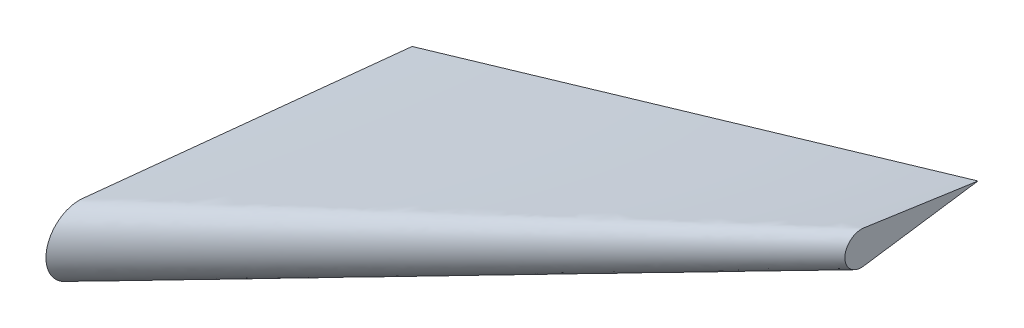
ISO-10303-21;
HEADER;
FILE_DESCRIPTION(('STEP AP214'),'2;1');
FILE_NAME('part.step','',(''),(''),'','','');
FILE_SCHEMA(('AUTOMOTIVE_DESIGN { 1 0 10303 214 1 1 1 1 }'));
ENDSEC;
DATA;
#1=APPLICATION_CONTEXT('core data for automotive mechanical design processes');
#2=APPLICATION_PROTOCOL_DEFINITION('international standard','automotive_design',2000,#1);
#3=PRODUCT_CONTEXT('',#1,'mechanical');
#4=PRODUCT('Part','Part','',(#3));
#5=PRODUCT_RELATED_PRODUCT_CATEGORY('part','',(#4));
#6=PRODUCT_DEFINITION_FORMATION('','',#4);
#7=PRODUCT_DEFINITION_CONTEXT('part definition',#1,'design');
#8=PRODUCT_DEFINITION('design','',#6,#7);
#9=PRODUCT_DEFINITION_SHAPE('','',#8);
#10=(LENGTH_UNIT() NAMED_UNIT(*) SI_UNIT(.MILLI.,.METRE.));
#11=(NAMED_UNIT(*) PLANE_ANGLE_UNIT() SI_UNIT($,.RADIAN.));
#12=(NAMED_UNIT(*) SI_UNIT($,.STERADIAN.) SOLID_ANGLE_UNIT());
#13=UNCERTAINTY_MEASURE_WITH_UNIT(LENGTH_MEASURE(1.E-05),#10,'distance_accuracy_value','');
#14=(GEOMETRIC_REPRESENTATION_CONTEXT(3) GLOBAL_UNCERTAINTY_ASSIGNED_CONTEXT((#13)) GLOBAL_UNIT_ASSIGNED_CONTEXT((#10,
#11,#12)) REPRESENTATION_CONTEXT('',''));
#15=CARTESIAN_POINT('',(0.,0.,0.));
#16=DIRECTION('',(0.,0.,1.));
#17=DIRECTION('',(1.,0.,0.));
#18=AXIS2_PLACEMENT_3D('',#15,#16,#17);
#19=CARTESIAN_POINT('',(150.,50.0000000000003,-2800.));
#20=DIRECTION('',(-1.,0.,0.));
#21=DIRECTION('',(0.,0.,1.));
#22=AXIS2_PLACEMENT_3D('',#19,#20,#21);
#23=PLANE('',#22);
#24=CARTESIAN_POINT('',(150.,50.0000000000003,-2800.));
#25=DIRECTION('',(1.,0.,0.));
#26=DIRECTION('',(0.,0.,1.));
#27=AXIS2_PLACEMENT_3D('',#24,#25,#26);
#28=CIRCLE('',#27,50.);
#29=CARTESIAN_POINT('',(150.,99.7493718552689,-2805.00000000062));
#30=VERTEX_POINT('',#29);
#31=CARTESIAN_POINT('',(150.,0.250628144669363,-2805.));
#32=VERTEX_POINT('',#31);
#33=EDGE_CURVE('E223',#30,#32,#28,.T.);
#34=ORIENTED_EDGE('',*,*,#33,.F.);
#35=DIRECTION('',(0.,0.100000000000001,0.99498743710662));
#36=VECTOR('',#35,1.);
#37=CARTESIAN_POINT('',(150.,99.7493718553313,-2805.));
#38=LINE('',#37,#36);
#39=CARTESIAN_POINT('',(150.,49.9999999999999,-3300.));
#40=VERTEX_POINT('',#39);
#41=EDGE_CURVE('E89',#40,#30,#38,.T.);
#42=ORIENTED_EDGE('',*,*,#41,.F.);
#43=DIRECTION('',(0.,0.099999999999999,-0.99498743710662));
#44=VECTOR('',#43,1.);
#45=CARTESIAN_POINT('',(150.,49.9999999999999,-3300.));
#46=LINE('',#45,#44);
#47=EDGE_CURVE('E12',#32,#40,#46,.T.);
#48=ORIENTED_EDGE('',*,*,#47,.F.);
#49=EDGE_LOOP('',(#34,#42,#48));
#50=FACE_BOUND('',#49,.T.);
#51=ADVANCED_FACE('F79',(#50),#23,.T.);
#52=CARTESIAN_POINT('',(750.,50.0000000000003,-3375.));
#53=DIRECTION('',(-1.,0.,0.));
#54=DIRECTION('',(0.,0.,1.));
#55=AXIS2_PLACEMENT_3D('',#52,#53,#54);
#56=PLANE('',#55);
#57=CARTESIAN_POINT('',(750.,50.0000000000003,-3375.));
#58=DIRECTION('',(1.,0.,0.));
#59=DIRECTION('',(0.,0.,1.));
#60=AXIS2_PLACEMENT_3D('',#57,#58,#59);
#61=CIRCLE('',#60,25.0000000000001);
#62=CARTESIAN_POINT('',(750.,74.7435829652701,-3378.57142857143));
#63=VERTEX_POINT('',#62);
#64=CARTESIAN_POINT('',(750.,25.2564170347306,-3378.57142857143));
#65=VERTEX_POINT('',#64);
#66=EDGE_CURVE('E121',#63,#65,#61,.T.);
#67=ORIENTED_EDGE('',*,*,#66,.T.);
#68=DIRECTION('',(0.,0.142857142857143,-0.989743318610787));
#69=VECTOR('',#68,1.);
#70=CARTESIAN_POINT('',(750.,50.0000000000003,-3550.));
#71=LINE('',#70,#69);
#72=CARTESIAN_POINT('',(750.,50.0000000000003,-3550.));
#73=VERTEX_POINT('',#72);
#74=EDGE_CURVE('E124',#65,#73,#71,.T.);
#75=ORIENTED_EDGE('',*,*,#74,.T.);
#76=DIRECTION('',(0.,0.142857142857143,0.989743318610787));
#77=VECTOR('',#76,1.);
#78=CARTESIAN_POINT('',(750.,74.7435829652701,-3378.57142857143));
#79=LINE('',#78,#77);
#80=EDGE_CURVE('E117',#73,#63,#79,.T.);
#81=ORIENTED_EDGE('',*,*,#80,.T.);
#82=EDGE_LOOP('',(#67,#75,#81));
#83=FACE_BOUND('',#82,.T.);
#84=ADVANCED_FACE('F120',(#83),#56,.F.);
#85=CARTESIAN_POINT('',(750.,25.2564170347306,-3378.57142857143));
#86=CARTESIAN_POINT('',(150.,0.250628144669356,-2805.));
#87=CARTESIAN_POINT('',(750.,25.0312906270699,-3377.01170706665));
#88=CARTESIAN_POINT('',(150.,-0.153878540013768,-2800.97520930515));
#89=CARTESIAN_POINT('',(749.999999999998,24.8678425366934,-3373.78788981886));
#90=CARTESIAN_POINT('',(150.,0.0378503320584925,-2793.11748342712));
#91=CARTESIAN_POINT('',(750.000000000002,25.5985410870597,-3368.81315011377));
#92=CARTESIAN_POINT('',(150.,2.82119825647951,-2782.28793048703));
#93=CARTESIAN_POINT('',(749.999999999998,27.3825948533682,-3363.91999791053));
#94=CARTESIAN_POINT('',(150.,7.6560109569923,-2772.72666890258));
#95=CARTESIAN_POINT('',(750.000000000001,30.2400988588709,-3359.36575962882));
#96=CARTESIAN_POINT('',(150.,14.1710061298125,-2764.62588718807));
#97=CARTESIAN_POINT('',(750.,34.1155884079043,-3355.42790246023));
#98=CARTESIAN_POINT('',(150.,21.9949014711557,-2758.17777385777));
#99=CARTESIAN_POINT('',(750.000000000001,38.8662233129304,-3352.37673290539));
#100=CARTESIAN_POINT('',(150.,30.7945046782643,-2753.48203210744));
#101=CARTESIAN_POINT('',(749.999999999999,44.2617185797718,-3350.44198341252));
#102=CARTESIAN_POINT('',(150.,40.2366234483809,-2750.63836513282));
#103=CARTESIAN_POINT('',(750.,50.0000000000001,-3349.77877154672));
#104=CARTESIAN_POINT('',(150.,50.0000000000012,-2749.67955033944));
#105=CARTESIAN_POINT('',(750.000000000001,55.7382814202284,-3350.44198341252));
#106=CARTESIAN_POINT('',(150.,59.7633765516211,-2750.63836513281));
#107=CARTESIAN_POINT('',(749.999999999999,61.1337766870697,-3352.37673290539));
#108=CARTESIAN_POINT('',(150.,69.2054953217371,-2753.48203210743));
#109=CARTESIAN_POINT('',(750.,65.8844115920956,-3355.42790246023));
#110=CARTESIAN_POINT('',(150.,78.005098528846,-2758.17777385777));
#111=CARTESIAN_POINT('',(750.,69.7599011411303,-3359.36575962882));
#112=CARTESIAN_POINT('',(150.,85.8289938701892,-2764.62588718807));
#113=CARTESIAN_POINT('',(749.999999999998,72.6174051466325,-3363.91999791054));
#114=CARTESIAN_POINT('',(150.,92.3439890430084,-2772.72666890258));
#115=CARTESIAN_POINT('',(750.000000000002,74.4014589129411,-3368.81315011377));
#116=CARTESIAN_POINT('',(150.,97.1788017435206,-2782.28793048703));
#117=CARTESIAN_POINT('',(750.,75.1321574633072,-3373.78788981887));
#118=CARTESIAN_POINT('',(150.,99.9621496679426,-2793.11748342712));
#119=CARTESIAN_POINT('',(750.,74.9687093729307,-3377.01170706665));
#120=CARTESIAN_POINT('',(150.,100.153878540014,-2800.97520930515));
#121=CARTESIAN_POINT('',(750.,72.5617996097771,-3393.68726706272));
#122=CARTESIAN_POINT('',(150.,95.8291478311839,-2844.0057365467));
#123=CARTESIAN_POINT('',(749.999999999999,68.3925340028467,-3422.57278650853));
#124=CARTESIAN_POINT('',(150.,87.6792425292654,-2925.09627043687));
#125=CARTESIAN_POINT('',(750.000000000001,62.3717914826352,-3464.28571428572));
#126=CARTESIAN_POINT('',(150.,74.8746859276656,-3052.5));
#127=CARTESIAN_POINT('',(749.999999999999,56.3510489624241,-3505.9986420629));
#128=CARTESIAN_POINT('',(150.,62.0701293260658,-3179.90372956312));
#129=CARTESIAN_POINT('',(750.,52.1817833554934,-3534.88416150871));
#130=CARTESIAN_POINT('',(150.,53.9202240241473,-3260.9942634533));
#131=CARTESIAN_POINT('',(750.,50.0000000000003,-3550.));
#132=CARTESIAN_POINT('',(150.,49.9999999999999,-3300.));
#133=B_SPLINE_SURFACE_WITH_KNOTS('',3,1,((#85,#86),(#87,#88),(#89,#90),(#91,#92),(#93,#94),(#95,
#96),(#97,#98),(#99,#100),(#101,#102),(#103,#104),(#105,#106),(#107,#108),(#109,#110),(#111,
#112),(#113,#114),(#115,#116),(#117,#118),(#119,#120),(#121,#122),(#123,#124),(#125,#126),(#127,
#128),(#129,#130),(#131,#132)),.UNSPECIFIED.,.F.,.F.,.F.,(4,1,1,1,1,1,1,1,1,1,1,1,1,1,1,1,2,1,1,
1,4),(2,2),(0.,0.0182596773178691,0.0365193546357383,0.0547790319536074,0.0730387092714766,
0.0912983865893457,0.109558063907215,0.127817741225084,0.146077418542953,0.164337095860822,
0.182596773178691,0.200856450496561,0.21911612781443,0.237375805132299,0.255635482450168,
0.273895159768037,0.292154837085906,0.46911612781443,0.646077418542953,0.823038709271477,1.),
(0.,1.),.UNSPECIFIED.);
#134=DIRECTION('',(-0.923076923076923,0.,0.384615384615385));
#135=VECTOR('',#134,1.);
#136=CARTESIAN_POINT('',(450.,50.0000000000001,-3425.));
#137=LINE('',#136,#135);
#138=EDGE_CURVE('E104',#73,#40,#137,.T.);
#139=DIRECTION('',(0.722519613618792,0.0301119548784669,-0.690694344923678));
#140=VECTOR('',#139,1.);
#141=CARTESIAN_POINT('',(450.,12.7535225897,-3091.78571428571));
#142=LINE('',#141,#140);
#143=EDGE_CURVE('E133',#32,#65,#142,.T.);
#144=ORIENTED_EDGE('',*,*,#66,.F.);
#145=ORIENTED_EDGE('',*,*,#80,.F.);
#146=ORIENTED_EDGE('',*,*,#138,.T.);
#147=ORIENTED_EDGE('',*,*,#41,.T.);
#148=ORIENTED_EDGE('',*,*,#33,.T.);
#149=ORIENTED_EDGE('',*,*,#143,.T.);
#150=EDGE_LOOP('',(#144,#145,#146,#147,#148,#149));
#151=FACE_BOUND('',#150,.T.);
#152=ADVANCED_FACE('F131',(#151),#133,.T.);
#153=CARTESIAN_POINT('',(750.,50.0000000000003,-3550.));
#154=CARTESIAN_POINT('',(150.,49.9999999999999,-3300.));
#155=CARTESIAN_POINT('',(750.,25.2564170347306,-3378.57142857143));
#156=CARTESIAN_POINT('',(150.,0.250628144669376,-2805.));
#157=B_SPLINE_SURFACE_WITH_KNOTS('',1,1,((#153,#154),(#155,#156)),.UNSPECIFIED.,.F.,.F.,.F.,(2,
2),(2,2),(0.,1.),(0.,1.),.UNSPECIFIED.);
#158=ORIENTED_EDGE('',*,*,#74,.F.);
#159=ORIENTED_EDGE('',*,*,#143,.F.);
#160=ORIENTED_EDGE('',*,*,#47,.T.);
#161=ORIENTED_EDGE('',*,*,#138,.F.);
#162=EDGE_LOOP('',(#158,#159,#160,#161));
#163=FACE_BOUND('',#162,.T.);
#164=ADVANCED_FACE('F153',(#163),#157,.T.);
#165=CLOSED_SHELL('',(#51,#84,#152,#164));
#166=MANIFOLD_SOLID_BREP('B2',#165);
#167=ADVANCED_BREP_SHAPE_REPRESENTATION('',(#18,#166),#14);
#168=SHAPE_DEFINITION_REPRESENTATION(#9,#167);
ENDSEC;
END-ISO-10303-21;
